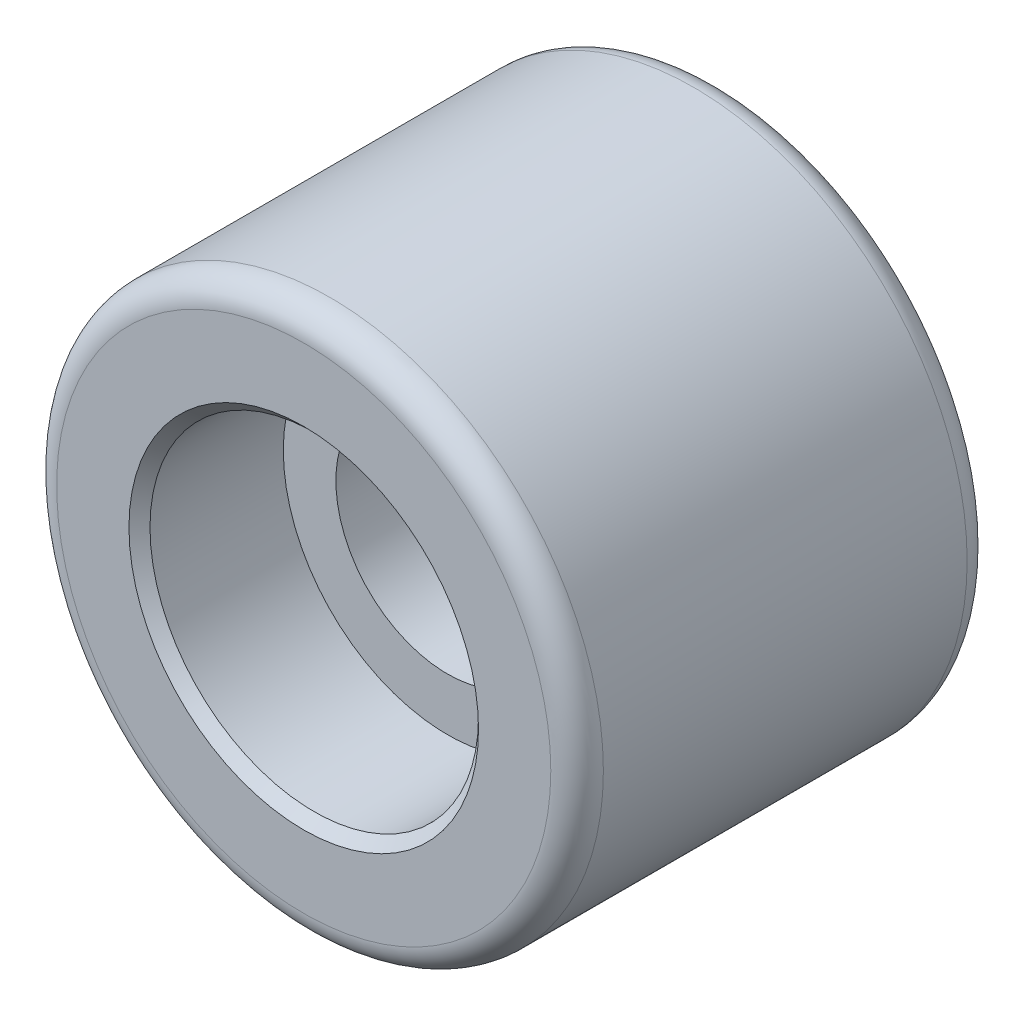
ISO-10303-21;
HEADER;
FILE_DESCRIPTION(('STEP AP214'),'2;1');
FILE_NAME('part.step','',(''),(''),'','','');
FILE_SCHEMA(('AUTOMOTIVE_DESIGN { 1 0 10303 214 1 1 1 1 }'));
ENDSEC;
DATA;
#1=APPLICATION_CONTEXT('core data for automotive mechanical design processes');
#2=APPLICATION_PROTOCOL_DEFINITION('international standard','automotive_design',2000,#1);
#3=PRODUCT_CONTEXT('',#1,'mechanical');
#4=PRODUCT('Part','Part','',(#3));
#5=PRODUCT_RELATED_PRODUCT_CATEGORY('part','',(#4));
#6=PRODUCT_DEFINITION_FORMATION('','',#4);
#7=PRODUCT_DEFINITION_CONTEXT('part definition',#1,'design');
#8=PRODUCT_DEFINITION('design','',#6,#7);
#9=PRODUCT_DEFINITION_SHAPE('','',#8);
#10=(LENGTH_UNIT() NAMED_UNIT(*) SI_UNIT(.MILLI.,.METRE.));
#11=(NAMED_UNIT(*) PLANE_ANGLE_UNIT() SI_UNIT($,.RADIAN.));
#12=(NAMED_UNIT(*) SI_UNIT($,.STERADIAN.) SOLID_ANGLE_UNIT());
#13=UNCERTAINTY_MEASURE_WITH_UNIT(LENGTH_MEASURE(1.E-05),#10,'distance_accuracy_value','');
#14=(GEOMETRIC_REPRESENTATION_CONTEXT(3) GLOBAL_UNCERTAINTY_ASSIGNED_CONTEXT((#13)) GLOBAL_UNIT_ASSIGNED_CONTEXT((#10,
#11,#12)) REPRESENTATION_CONTEXT('',''));
#15=CARTESIAN_POINT('',(0.,0.,0.));
#16=DIRECTION('',(0.,0.,1.));
#17=DIRECTION('',(1.,0.,0.));
#18=AXIS2_PLACEMENT_3D('',#15,#16,#17);
#19=CARTESIAN_POINT('',(-66.4148567119241,-15.9297626799818,25.146));
#20=DIRECTION('',(0.,0.,1.));
#21=DIRECTION('',(1.,0.,0.));
#22=AXIS2_PLACEMENT_3D('',#19,#20,#21);
#23=PLANE('',#22);
#24=CARTESIAN_POINT('',(-66.4148567119241,-15.9297626799818,25.146));
#25=DIRECTION('',(0.,0.,1.));
#26=DIRECTION('',(1.,0.,0.));
#27=AXIS2_PLACEMENT_3D('',#24,#25,#26);
#28=CIRCLE('',#27,10.55624);
#29=CARTESIAN_POINT('',(-55.8586167119241,-15.9297626799818,25.146));
#30=VERTEX_POINT('',#29);
#31=EDGE_CURVE('E63',#30,#30,#28,.T.);
#32=ORIENTED_EDGE('',*,*,#31,.F.);
#33=EDGE_LOOP('',(#32));
#34=FACE_BOUND('',#33,.T.);
#35=CARTESIAN_POINT('',(-66.4148567119241,-15.9297626799818,25.146));
#36=DIRECTION('',(0.,0.,1.));
#37=DIRECTION('',(1.,0.,0.));
#38=AXIS2_PLACEMENT_3D('',#35,#36,#37);
#39=CIRCLE('',#38,14.9225);
#40=CARTESIAN_POINT('',(-51.4923567119241,-15.9297626799818,25.146));
#41=VERTEX_POINT('',#40);
#42=EDGE_CURVE('E10',#41,#41,#39,.T.);
#43=ORIENTED_EDGE('',*,*,#42,.T.);
#44=EDGE_LOOP('',(#43));
#45=FACE_BOUND('',#44,.T.);
#46=ADVANCED_FACE('F31',(#34,#45),#23,.T.);
#47=CARTESIAN_POINT('',(-66.4148567119241,-15.9297626799818,0.));
#48=DIRECTION('',(0.,0.,1.));
#49=DIRECTION('',(1.,0.,0.));
#50=AXIS2_PLACEMENT_3D('',#47,#48,#49);
#51=PLANE('',#50);
#52=CARTESIAN_POINT('',(-66.4148567119241,-15.9297626799818,0.));
#53=DIRECTION('',(0.,0.,1.));
#54=DIRECTION('',(1.,0.,0.));
#55=AXIS2_PLACEMENT_3D('',#52,#53,#54);
#56=CIRCLE('',#55,6.74624);
#57=CARTESIAN_POINT('',(-59.6686167119241,-15.9297626799818,0.));
#58=VERTEX_POINT('',#57);
#59=EDGE_CURVE('E51',#58,#58,#56,.T.);
#60=ORIENTED_EDGE('',*,*,#59,.T.);
#61=EDGE_LOOP('',(#60));
#62=FACE_BOUND('',#61,.T.);
#63=CARTESIAN_POINT('',(-66.4148567119241,-15.9297626799818,0.));
#64=DIRECTION('',(0.,0.,1.));
#65=DIRECTION('',(1.,0.,0.));
#66=AXIS2_PLACEMENT_3D('',#63,#64,#65);
#67=CIRCLE('',#66,14.9225);
#68=CARTESIAN_POINT('',(-51.4923567119241,-15.9297626799818,0.));
#69=VERTEX_POINT('',#68);
#70=EDGE_CURVE('E38',#69,#69,#67,.F.);
#71=ORIENTED_EDGE('',*,*,#70,.T.);
#72=EDGE_LOOP('',(#71));
#73=FACE_BOUND('',#72,.T.);
#74=ADVANCED_FACE('F70',(#62,#73),#51,.F.);
#75=CARTESIAN_POINT('',(-66.4148567119241,-15.9297626799818,25.146));
#76=DIRECTION('',(0.,0.,-1.));
#77=DIRECTION('',(-1.,0.,0.));
#78=AXIS2_PLACEMENT_3D('',#75,#76,#77);
#79=CYLINDRICAL_SURFACE('',#78,16.51);
#80=CARTESIAN_POINT('',(-66.4148567119241,-15.9297626799818,1.5875));
#81=DIRECTION('',(0.,0.,1.));
#82=DIRECTION('',(1.,0.,0.));
#83=AXIS2_PLACEMENT_3D('',#80,#81,#82);
#84=CIRCLE('',#83,16.51);
#85=CARTESIAN_POINT('',(-49.9048567119241,-15.9297626799818,1.5875));
#86=VERTEX_POINT('',#85);
#87=EDGE_CURVE('E42',#86,#86,#84,.T.);
#88=ORIENTED_EDGE('',*,*,#87,.T.);
#89=EDGE_LOOP('',(#88));
#90=FACE_BOUND('',#89,.T.);
#91=CARTESIAN_POINT('',(-66.4148567119241,-15.9297626799818,23.5585));
#92=DIRECTION('',(0.,0.,1.));
#93=DIRECTION('',(1.,0.,0.));
#94=AXIS2_PLACEMENT_3D('',#91,#92,#93);
#95=CIRCLE('',#94,16.51);
#96=CARTESIAN_POINT('',(-49.9048567119241,-15.9297626799818,23.5585));
#97=VERTEX_POINT('',#96);
#98=EDGE_CURVE('E46',#97,#97,#95,.F.);
#99=ORIENTED_EDGE('',*,*,#98,.T.);
#100=EDGE_LOOP('',(#99));
#101=FACE_BOUND('',#100,.T.);
#102=ADVANCED_FACE('F75',(#90,#101),#79,.T.);
#103=CARTESIAN_POINT('',(-66.4148567119241,-15.9297626799818,1.5875));
#104=DIRECTION('',(0.,0.,1.));
#105=DIRECTION('',(1.,0.,0.));
#106=AXIS2_PLACEMENT_3D('',#103,#104,#105);
#107=TOROIDAL_SURFACE('',#106,14.9225,1.5875);
#108=ORIENTED_EDGE('',*,*,#70,.F.);
#109=EDGE_LOOP('',(#108));
#110=FACE_BOUND('',#109,.T.);
#111=ORIENTED_EDGE('',*,*,#87,.F.);
#112=EDGE_LOOP('',(#111));
#113=FACE_BOUND('',#112,.T.);
#114=ADVANCED_FACE('F83',(#110,#113),#107,.T.);
#115=CARTESIAN_POINT('',(-66.4148567119241,-15.9297626799818,23.5585));
#116=DIRECTION('',(0.,0.,1.));
#117=DIRECTION('',(1.,0.,0.));
#118=AXIS2_PLACEMENT_3D('',#115,#116,#117);
#119=TOROIDAL_SURFACE('',#118,14.9225,1.5875);
#120=ORIENTED_EDGE('',*,*,#98,.F.);
#121=EDGE_LOOP('',(#120));
#122=FACE_BOUND('',#121,.T.);
#123=ORIENTED_EDGE('',*,*,#42,.F.);
#124=EDGE_LOOP('',(#123));
#125=FACE_BOUND('',#124,.T.);
#126=ADVANCED_FACE('F33',(#122,#125),#119,.T.);
#127=CARTESIAN_POINT('',(-66.4148567119241,-15.9297626799818,25.146));
#128=DIRECTION('',(0.,0.,1.));
#129=DIRECTION('',(1.,0.,0.));
#130=AXIS2_PLACEMENT_3D('',#127,#128,#129);
#131=CYLINDRICAL_SURFACE('',#130,6.74624);
#132=ORIENTED_EDGE('',*,*,#59,.F.);
#133=EDGE_LOOP('',(#132));
#134=FACE_BOUND('',#133,.T.);
#135=CARTESIAN_POINT('',(-66.4148567119241,-15.9297626799818,16.4592));
#136=DIRECTION('',(0.,0.,1.));
#137=DIRECTION('',(1.,0.,0.));
#138=AXIS2_PLACEMENT_3D('',#135,#136,#137);
#139=CIRCLE('',#138,6.74624);
#140=CARTESIAN_POINT('',(-59.6686167119241,-15.9297626799818,16.4592));
#141=VERTEX_POINT('',#140);
#142=EDGE_CURVE('E54',#141,#141,#139,.T.);
#143=ORIENTED_EDGE('',*,*,#142,.T.);
#144=EDGE_LOOP('',(#143));
#145=FACE_BOUND('',#144,.T.);
#146=ADVANCED_FACE('F79',(#134,#145),#131,.F.);
#147=CARTESIAN_POINT('',(-56.4936167119241,-15.9297626799818,16.4592));
#148=DIRECTION('',(0.,0.,-1.));
#149=DIRECTION('',(-1.,0.,0.));
#150=AXIS2_PLACEMENT_3D('',#147,#148,#149);
#151=PLANE('',#150);
#152=ORIENTED_EDGE('',*,*,#142,.F.);
#153=EDGE_LOOP('',(#152));
#154=FACE_BOUND('',#153,.T.);
#155=CARTESIAN_POINT('',(-66.4148567119241,-15.9297626799818,16.4592));
#156=DIRECTION('',(0.,0.,1.));
#157=DIRECTION('',(1.,0.,0.));
#158=AXIS2_PLACEMENT_3D('',#155,#156,#157);
#159=CIRCLE('',#158,9.92124);
#160=CARTESIAN_POINT('',(-56.4936167119241,-15.9297626799818,16.4592));
#161=VERTEX_POINT('',#160);
#162=EDGE_CURVE('E57',#161,#161,#159,.T.);
#163=ORIENTED_EDGE('',*,*,#162,.T.);
#164=EDGE_LOOP('',(#163));
#165=FACE_BOUND('',#164,.T.);
#166=ADVANCED_FACE('F99',(#154,#165),#151,.F.);
#167=CARTESIAN_POINT('',(-66.4148567119241,-15.9297626799818,25.146));
#168=DIRECTION('',(0.,0.,1.));
#169=DIRECTION('',(1.,0.,0.));
#170=AXIS2_PLACEMENT_3D('',#167,#168,#169);
#171=CYLINDRICAL_SURFACE('',#170,9.92124);
#172=ORIENTED_EDGE('',*,*,#162,.F.);
#173=EDGE_LOOP('',(#172));
#174=FACE_BOUND('',#173,.T.);
#175=CARTESIAN_POINT('',(-66.4148567119241,-15.9297626799818,24.511));
#176=DIRECTION('',(0.,0.,1.));
#177=DIRECTION('',(1.,0.,0.));
#178=AXIS2_PLACEMENT_3D('',#175,#176,#177);
#179=CIRCLE('',#178,9.92124);
#180=CARTESIAN_POINT('',(-56.4936167119241,-15.9297626799818,24.511));
#181=VERTEX_POINT('',#180);
#182=EDGE_CURVE('E60',#181,#181,#179,.T.);
#183=ORIENTED_EDGE('',*,*,#182,.T.);
#184=EDGE_LOOP('',(#183));
#185=FACE_BOUND('',#184,.T.);
#186=ADVANCED_FACE('F104',(#174,#185),#171,.F.);
#187=CARTESIAN_POINT('',(-66.4148567119241,-15.9297626799818,25.146));
#188=DIRECTION('',(0.,0.,1.));
#189=DIRECTION('',(1.,0.,0.));
#190=AXIS2_PLACEMENT_3D('',#187,#188,#189);
#191=CONICAL_SURFACE('',#190,10.55624,0.785398163397446);
#192=ORIENTED_EDGE('',*,*,#182,.F.);
#193=EDGE_LOOP('',(#192));
#194=FACE_BOUND('',#193,.T.);
#195=ORIENTED_EDGE('',*,*,#31,.T.);
#196=EDGE_LOOP('',(#195));
#197=FACE_BOUND('',#196,.T.);
#198=ADVANCED_FACE('F67',(#194,#197),#191,.F.);
#199=CLOSED_SHELL('',(#46,#74,#102,#114,#126,#146,#166,#186,#198));
#200=MANIFOLD_SOLID_BREP('B2',#199);
#201=ADVANCED_BREP_SHAPE_REPRESENTATION('',(#18,#200),#14);
#202=SHAPE_DEFINITION_REPRESENTATION(#9,#201);
ENDSEC;
END-ISO-10303-21;
